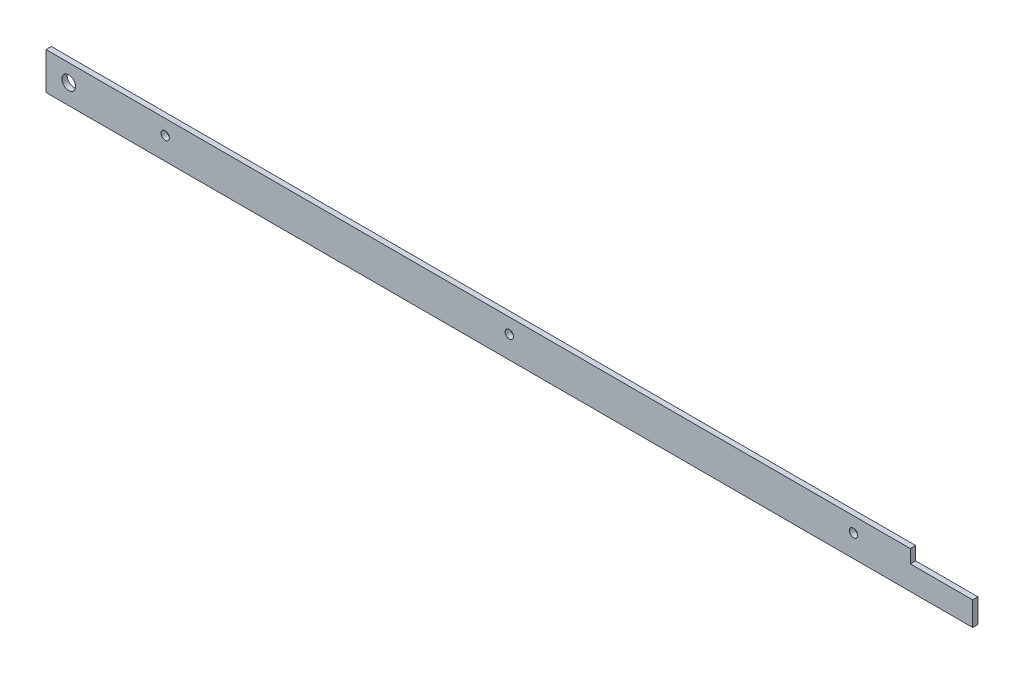
ISO-10303-21;
HEADER;
FILE_DESCRIPTION(('STEP AP214'),'2;1');
FILE_NAME('part.step','',(''),(''),'','','');
FILE_SCHEMA(('AUTOMOTIVE_DESIGN { 1 0 10303 214 1 1 1 1 }'));
ENDSEC;
DATA;
#1=APPLICATION_CONTEXT('core data for automotive mechanical design processes');
#2=APPLICATION_PROTOCOL_DEFINITION('international standard','automotive_design',2000,#1);
#3=PRODUCT_CONTEXT('',#1,'mechanical');
#4=PRODUCT('Part','Part','',(#3));
#5=PRODUCT_RELATED_PRODUCT_CATEGORY('part','',(#4));
#6=PRODUCT_DEFINITION_FORMATION('','',#4);
#7=PRODUCT_DEFINITION_CONTEXT('part definition',#1,'design');
#8=PRODUCT_DEFINITION('design','',#6,#7);
#9=PRODUCT_DEFINITION_SHAPE('','',#8);
#10=(LENGTH_UNIT() NAMED_UNIT(*) SI_UNIT(.MILLI.,.METRE.));
#11=(NAMED_UNIT(*) PLANE_ANGLE_UNIT() SI_UNIT($,.RADIAN.));
#12=(NAMED_UNIT(*) SI_UNIT($,.STERADIAN.) SOLID_ANGLE_UNIT());
#13=UNCERTAINTY_MEASURE_WITH_UNIT(LENGTH_MEASURE(1.E-05),#10,'distance_accuracy_value','');
#14=(GEOMETRIC_REPRESENTATION_CONTEXT(3) GLOBAL_UNCERTAINTY_ASSIGNED_CONTEXT((#13)) GLOBAL_UNIT_ASSIGNED_CONTEXT((#10,
#11,#12)) REPRESENTATION_CONTEXT('',''));
#15=CARTESIAN_POINT('',(0.,0.,0.));
#16=DIRECTION('',(0.,0.,1.));
#17=DIRECTION('',(1.,0.,0.));
#18=AXIS2_PLACEMENT_3D('',#15,#16,#17);
#19=CARTESIAN_POINT('',(0.,9.44698802890072,3.175));
#20=DIRECTION('',(0.,1.,0.));
#21=DIRECTION('',(0.,0.,1.));
#22=AXIS2_PLACEMENT_3D('',#19,#20,#21);
#23=PLANE('',#22);
#24=DIRECTION('',(1.,0.,0.));
#25=VECTOR('',#24,1.);
#26=CARTESIAN_POINT('',(0.,9.44698802890072,0.));
#27=LINE('',#26,#25);
#28=CARTESIAN_POINT('',(515.860000058,9.44698802890072,0.));
#29=VERTEX_POINT('',#28);
#30=CARTESIAN_POINT('',(553.1,9.44698802890072,0.));
#31=VERTEX_POINT('',#30);
#32=EDGE_CURVE('E137',#29,#31,#27,.T.);
#33=ORIENTED_EDGE('',*,*,#32,.F.);
#34=DIRECTION('',(0.,0.,-1.));
#35=VECTOR('',#34,1.);
#36=CARTESIAN_POINT('',(515.860000058,9.44698802890072,3.175));
#37=LINE('',#36,#35);
#38=CARTESIAN_POINT('',(515.860000058,9.44698802890072,3.175));
#39=VERTEX_POINT('',#38);
#40=EDGE_CURVE('E11',#39,#29,#37,.T.);
#41=ORIENTED_EDGE('',*,*,#40,.F.);
#42=DIRECTION('',(1.,0.,0.));
#43=VECTOR('',#42,1.);
#44=CARTESIAN_POINT('',(0.,9.44698802890072,3.175));
#45=LINE('',#44,#43);
#46=CARTESIAN_POINT('',(553.1,9.44698802890072,3.175));
#47=VERTEX_POINT('',#46);
#48=EDGE_CURVE('E162',#39,#47,#45,.T.);
#49=ORIENTED_EDGE('',*,*,#48,.T.);
#50=DIRECTION('',(0.,0.,-1.));
#51=VECTOR('',#50,1.);
#52=CARTESIAN_POINT('',(553.1,9.44698802890072,3.175));
#53=LINE('',#52,#51);
#54=EDGE_CURVE('E57',#47,#31,#53,.T.);
#55=ORIENTED_EDGE('',*,*,#54,.T.);
#56=EDGE_LOOP('',(#33,#41,#49,#55));
#57=FACE_BOUND('',#56,.T.);
#58=ADVANCED_FACE('F41',(#57),#23,.T.);
#59=CARTESIAN_POINT('',(515.860000058,0.,3.175));
#60=DIRECTION('',(-1.,0.,0.));
#61=DIRECTION('',(0.,0.,1.));
#62=AXIS2_PLACEMENT_3D('',#59,#60,#61);
#63=PLANE('',#62);
#64=DIRECTION('',(0.,1.,0.));
#65=VECTOR('',#64,1.);
#66=CARTESIAN_POINT('',(515.860000058,0.,0.));
#67=LINE('',#66,#65);
#68=CARTESIAN_POINT('',(515.860000058,17.3919880289007,0.));
#69=VERTEX_POINT('',#68);
#70=EDGE_CURVE('E139',#29,#69,#67,.T.);
#71=ORIENTED_EDGE('',*,*,#70,.T.);
#72=DIRECTION('',(0.,0.,-1.));
#73=VECTOR('',#72,1.);
#74=CARTESIAN_POINT('',(515.860000058,17.3919880289007,3.175));
#75=LINE('',#74,#73);
#76=CARTESIAN_POINT('',(515.860000058,17.3919880289007,3.175));
#77=VERTEX_POINT('',#76);
#78=EDGE_CURVE('E49',#77,#69,#75,.T.);
#79=ORIENTED_EDGE('',*,*,#78,.F.);
#80=DIRECTION('',(0.,1.,0.));
#81=VECTOR('',#80,1.);
#82=CARTESIAN_POINT('',(515.860000058,0.,3.175));
#83=LINE('',#82,#81);
#84=EDGE_CURVE('E120',#39,#77,#83,.T.);
#85=ORIENTED_EDGE('',*,*,#84,.F.);
#86=ORIENTED_EDGE('',*,*,#40,.T.);
#87=EDGE_LOOP('',(#71,#79,#85,#86));
#88=FACE_BOUND('',#87,.T.);
#89=ADVANCED_FACE('F191',(#88),#63,.F.);
#90=CARTESIAN_POINT('',(0.,17.3919880289006,3.175));
#91=DIRECTION('',(0.,-1.,0.));
#92=DIRECTION('',(1.,0.,0.));
#93=AXIS2_PLACEMENT_3D('',#90,#91,#92);
#94=PLANE('',#93);
#95=DIRECTION('',(-1.,0.,0.));
#96=VECTOR('',#95,1.);
#97=CARTESIAN_POINT('',(0.,17.3919880289006,0.));
#98=LINE('',#97,#96);
#99=CARTESIAN_POINT('',(0.,17.3919880289006,0.));
#100=VERTEX_POINT('',#99);
#101=EDGE_CURVE('E141',#69,#100,#98,.T.);
#102=ORIENTED_EDGE('',*,*,#101,.T.);
#103=DIRECTION('',(0.,0.,-1.));
#104=VECTOR('',#103,1.);
#105=CARTESIAN_POINT('',(0.,17.3919880289006,3.175));
#106=LINE('',#105,#104);
#107=CARTESIAN_POINT('',(0.,17.3919880289006,3.175));
#108=VERTEX_POINT('',#107);
#109=EDGE_CURVE('E105',#108,#100,#106,.T.);
#110=ORIENTED_EDGE('',*,*,#109,.F.);
#111=DIRECTION('',(-1.,0.,0.));
#112=VECTOR('',#111,1.);
#113=CARTESIAN_POINT('',(0.,17.3919880289006,3.175));
#114=LINE('',#113,#112);
#115=EDGE_CURVE('E117',#77,#108,#114,.T.);
#116=ORIENTED_EDGE('',*,*,#115,.F.);
#117=ORIENTED_EDGE('',*,*,#78,.T.);
#118=EDGE_LOOP('',(#102,#110,#116,#117));
#119=FACE_BOUND('',#118,.T.);
#120=ADVANCED_FACE('F169',(#119),#94,.F.);
#121=CARTESIAN_POINT('',(0.,0.,3.175));
#122=DIRECTION('',(-1.,0.,0.));
#123=DIRECTION('',(0.,0.,1.));
#124=AXIS2_PLACEMENT_3D('',#121,#122,#123);
#125=PLANE('',#124);
#126=DIRECTION('',(0.,1.,0.));
#127=VECTOR('',#126,1.);
#128=CARTESIAN_POINT('',(0.,0.,0.));
#129=LINE('',#128,#127);
#130=CARTESIAN_POINT('',(0.,-4.83301197109929,0.));
#131=VERTEX_POINT('',#130);
#132=EDGE_CURVE('E102',#131,#100,#129,.T.);
#133=ORIENTED_EDGE('',*,*,#132,.F.);
#134=DIRECTION('',(0.,0.,-1.));
#135=VECTOR('',#134,1.);
#136=CARTESIAN_POINT('',(0.,-4.83301197109929,3.175));
#137=LINE('',#136,#135);
#138=CARTESIAN_POINT('',(0.,-4.83301197109929,3.175));
#139=VERTEX_POINT('',#138);
#140=EDGE_CURVE('E96',#139,#131,#137,.T.);
#141=ORIENTED_EDGE('',*,*,#140,.F.);
#142=DIRECTION('',(0.,1.,0.));
#143=VECTOR('',#142,1.);
#144=CARTESIAN_POINT('',(0.,0.,3.175));
#145=LINE('',#144,#143);
#146=EDGE_CURVE('E100',#139,#108,#145,.T.);
#147=ORIENTED_EDGE('',*,*,#146,.T.);
#148=ORIENTED_EDGE('',*,*,#109,.T.);
#149=EDGE_LOOP('',(#133,#141,#147,#148));
#150=FACE_BOUND('',#149,.T.);
#151=ADVANCED_FACE('F98',(#150),#125,.T.);
#152=CARTESIAN_POINT('',(0.,-4.83301197109929,3.175));
#153=DIRECTION('',(0.,1.,0.));
#154=DIRECTION('',(0.,0.,1.));
#155=AXIS2_PLACEMENT_3D('',#152,#153,#154);
#156=PLANE('',#155);
#157=DIRECTION('',(1.,0.,0.));
#158=VECTOR('',#157,1.);
#159=CARTESIAN_POINT('',(0.,-4.83301197109929,0.));
#160=LINE('',#159,#158);
#161=CARTESIAN_POINT('',(553.1,-4.83301197109929,0.));
#162=VERTEX_POINT('',#161);
#163=EDGE_CURVE('E145',#131,#162,#160,.T.);
#164=ORIENTED_EDGE('',*,*,#163,.T.);
#165=DIRECTION('',(0.,0.,-1.));
#166=VECTOR('',#165,1.);
#167=CARTESIAN_POINT('',(553.1,-4.83301197109929,3.175));
#168=LINE('',#167,#166);
#169=CARTESIAN_POINT('',(553.1,-4.83301197109929,3.175));
#170=VERTEX_POINT('',#169);
#171=EDGE_CURVE('E77',#170,#162,#168,.T.);
#172=ORIENTED_EDGE('',*,*,#171,.F.);
#173=DIRECTION('',(1.,0.,0.));
#174=VECTOR('',#173,1.);
#175=CARTESIAN_POINT('',(0.,-4.83301197109929,3.175));
#176=LINE('',#175,#174);
#177=EDGE_CURVE('E107',#139,#170,#176,.T.);
#178=ORIENTED_EDGE('',*,*,#177,.F.);
#179=ORIENTED_EDGE('',*,*,#140,.T.);
#180=EDGE_LOOP('',(#164,#172,#178,#179));
#181=FACE_BOUND('',#180,.T.);
#182=ADVANCED_FACE('F108',(#181),#156,.F.);
#183=CARTESIAN_POINT('',(481.98,8.5094880289007,3.175));
#184=DIRECTION('',(0.,0.,-1.));
#185=DIRECTION('',(-1.,0.,0.));
#186=AXIS2_PLACEMENT_3D('',#183,#184,#185);
#187=CYLINDRICAL_SURFACE('',#186,2.48920000000001);
#188=CARTESIAN_POINT('',(481.98,8.5094880289007,3.175));
#189=DIRECTION('',(0.,0.,1.));
#190=DIRECTION('',(1.,0.,0.));
#191=AXIS2_PLACEMENT_3D('',#188,#189,#190);
#192=CIRCLE('',#191,2.48920000000001);
#193=CARTESIAN_POINT('',(484.4692,8.5094880289007,3.175));
#194=VERTEX_POINT('',#193);
#195=EDGE_CURVE('E131',#194,#194,#192,.T.);
#196=ORIENTED_EDGE('',*,*,#195,.T.);
#197=EDGE_LOOP('',(#196));
#198=FACE_BOUND('',#197,.T.);
#199=CARTESIAN_POINT('',(481.98,8.5094880289007,0.));
#200=DIRECTION('',(0.,0.,1.));
#201=DIRECTION('',(1.,0.,0.));
#202=AXIS2_PLACEMENT_3D('',#199,#200,#201);
#203=CIRCLE('',#202,2.48920000000001);
#204=CARTESIAN_POINT('',(484.4692,8.5094880289007,0.));
#205=VERTEX_POINT('',#204);
#206=EDGE_CURVE('E156',#205,#205,#203,.T.);
#207=ORIENTED_EDGE('',*,*,#206,.F.);
#208=EDGE_LOOP('',(#207));
#209=FACE_BOUND('',#208,.T.);
#210=ADVANCED_FACE('F202',(#198,#209),#187,.F.);
#211=CARTESIAN_POINT('',(276.55,8.5094880289007,3.175));
#212=DIRECTION('',(0.,0.,-1.));
#213=DIRECTION('',(-1.,0.,0.));
#214=AXIS2_PLACEMENT_3D('',#211,#212,#213);
#215=CYLINDRICAL_SURFACE('',#214,2.48920000000001);
#216=CARTESIAN_POINT('',(276.55,8.5094880289007,3.175));
#217=DIRECTION('',(0.,0.,1.));
#218=DIRECTION('',(1.,0.,0.));
#219=AXIS2_PLACEMENT_3D('',#216,#217,#218);
#220=CIRCLE('',#219,2.48920000000001);
#221=CARTESIAN_POINT('',(279.0392,8.5094880289007,3.175));
#222=VERTEX_POINT('',#221);
#223=EDGE_CURVE('E128',#222,#222,#220,.T.);
#224=ORIENTED_EDGE('',*,*,#223,.T.);
#225=EDGE_LOOP('',(#224));
#226=FACE_BOUND('',#225,.T.);
#227=CARTESIAN_POINT('',(276.55,8.5094880289007,0.));
#228=DIRECTION('',(0.,0.,1.));
#229=DIRECTION('',(1.,0.,0.));
#230=AXIS2_PLACEMENT_3D('',#227,#228,#229);
#231=CIRCLE('',#230,2.48920000000001);
#232=CARTESIAN_POINT('',(279.0392,8.5094880289007,0.));
#233=VERTEX_POINT('',#232);
#234=EDGE_CURVE('E153',#233,#233,#231,.T.);
#235=ORIENTED_EDGE('',*,*,#234,.F.);
#236=EDGE_LOOP('',(#235));
#237=FACE_BOUND('',#236,.T.);
#238=ADVANCED_FACE('F186',(#226,#237),#215,.F.);
#239=CARTESIAN_POINT('',(71.12,8.5094880289007,3.175));
#240=DIRECTION('',(0.,0.,-1.));
#241=DIRECTION('',(-1.,0.,0.));
#242=AXIS2_PLACEMENT_3D('',#239,#240,#241);
#243=CYLINDRICAL_SURFACE('',#242,2.4892);
#244=CARTESIAN_POINT('',(71.12,8.5094880289007,3.175));
#245=DIRECTION('',(0.,0.,1.));
#246=DIRECTION('',(1.,0.,0.));
#247=AXIS2_PLACEMENT_3D('',#244,#245,#246);
#248=CIRCLE('',#247,2.4892);
#249=CARTESIAN_POINT('',(73.6092,8.5094880289007,3.175));
#250=VERTEX_POINT('',#249);
#251=EDGE_CURVE('E125',#250,#250,#248,.T.);
#252=ORIENTED_EDGE('',*,*,#251,.T.);
#253=EDGE_LOOP('',(#252));
#254=FACE_BOUND('',#253,.T.);
#255=CARTESIAN_POINT('',(71.12,8.5094880289007,0.));
#256=DIRECTION('',(0.,0.,1.));
#257=DIRECTION('',(1.,0.,0.));
#258=AXIS2_PLACEMENT_3D('',#255,#256,#257);
#259=CIRCLE('',#258,2.4892);
#260=CARTESIAN_POINT('',(73.6092,8.5094880289007,0.));
#261=VERTEX_POINT('',#260);
#262=EDGE_CURVE('E150',#261,#261,#259,.T.);
#263=ORIENTED_EDGE('',*,*,#262,.F.);
#264=EDGE_LOOP('',(#263));
#265=FACE_BOUND('',#264,.T.);
#266=ADVANCED_FACE('F178',(#254,#265),#243,.F.);
#267=CARTESIAN_POINT('',(553.1,0.,3.175));
#268=DIRECTION('',(1.,0.,0.));
#269=DIRECTION('',(0.,0.,-1.));
#270=AXIS2_PLACEMENT_3D('',#267,#268,#269);
#271=PLANE('',#270);
#272=DIRECTION('',(0.,-1.,0.));
#273=VECTOR('',#272,1.);
#274=CARTESIAN_POINT('',(553.1,0.,0.));
#275=LINE('',#274,#273);
#276=EDGE_CURVE('E147',#31,#162,#275,.T.);
#277=ORIENTED_EDGE('',*,*,#276,.F.);
#278=ORIENTED_EDGE('',*,*,#54,.F.);
#279=DIRECTION('',(0.,-1.,0.));
#280=VECTOR('',#279,1.);
#281=CARTESIAN_POINT('',(553.1,0.,3.175));
#282=LINE('',#281,#280);
#283=EDGE_CURVE('E111',#47,#170,#282,.T.);
#284=ORIENTED_EDGE('',*,*,#283,.T.);
#285=ORIENTED_EDGE('',*,*,#171,.T.);
#286=EDGE_LOOP('',(#277,#278,#284,#285));
#287=FACE_BOUND('',#286,.T.);
#288=ADVANCED_FACE('F175',(#287),#271,.T.);
#289=CARTESIAN_POINT('',(13.54,7.02698802890071,3.175));
#290=DIRECTION('',(0.,0.,-1.));
#291=DIRECTION('',(-1.,0.,0.));
#292=AXIS2_PLACEMENT_3D('',#289,#290,#291);
#293=CYLINDRICAL_SURFACE('',#292,4.0635);
#294=CARTESIAN_POINT('',(13.54,7.02698802890071,3.175));
#295=DIRECTION('',(0.,0.,1.));
#296=DIRECTION('',(1.,0.,0.));
#297=AXIS2_PLACEMENT_3D('',#294,#295,#296);
#298=CIRCLE('',#297,4.0635);
#299=CARTESIAN_POINT('',(17.6035,7.02698802890071,3.175));
#300=VERTEX_POINT('',#299);
#301=EDGE_CURVE('E134',#300,#300,#298,.F.);
#302=ORIENTED_EDGE('',*,*,#301,.F.);
#303=EDGE_LOOP('',(#302));
#304=FACE_BOUND('',#303,.T.);
#305=CARTESIAN_POINT('',(13.54,7.02698802890071,0.));
#306=DIRECTION('',(0.,0.,1.));
#307=DIRECTION('',(1.,0.,0.));
#308=AXIS2_PLACEMENT_3D('',#305,#306,#307);
#309=CIRCLE('',#308,4.0635);
#310=CARTESIAN_POINT('',(17.6035,7.02698802890071,0.));
#311=VERTEX_POINT('',#310);
#312=EDGE_CURVE('E159',#311,#311,#309,.F.);
#313=ORIENTED_EDGE('',*,*,#312,.T.);
#314=EDGE_LOOP('',(#313));
#315=FACE_BOUND('',#314,.T.);
#316=ADVANCED_FACE('F177',(#304,#315),#293,.F.);
#317=CARTESIAN_POINT('',(0.,0.,3.175));
#318=DIRECTION('',(0.,0.,1.));
#319=DIRECTION('',(1.,0.,0.));
#320=AXIS2_PLACEMENT_3D('',#317,#318,#319);
#321=PLANE('',#320);
#322=ORIENTED_EDGE('',*,*,#48,.F.);
#323=ORIENTED_EDGE('',*,*,#84,.T.);
#324=ORIENTED_EDGE('',*,*,#115,.T.);
#325=ORIENTED_EDGE('',*,*,#146,.F.);
#326=ORIENTED_EDGE('',*,*,#177,.T.);
#327=ORIENTED_EDGE('',*,*,#283,.F.);
#328=EDGE_LOOP('',(#322,#323,#324,#325,#326,#327));
#329=FACE_BOUND('',#328,.T.);
#330=ORIENTED_EDGE('',*,*,#251,.F.);
#331=EDGE_LOOP('',(#330));
#332=FACE_BOUND('',#331,.T.);
#333=ORIENTED_EDGE('',*,*,#223,.F.);
#334=EDGE_LOOP('',(#333));
#335=FACE_BOUND('',#334,.T.);
#336=ORIENTED_EDGE('',*,*,#195,.F.);
#337=EDGE_LOOP('',(#336));
#338=FACE_BOUND('',#337,.T.);
#339=ORIENTED_EDGE('',*,*,#301,.T.);
#340=EDGE_LOOP('',(#339));
#341=FACE_BOUND('',#340,.T.);
#342=ADVANCED_FACE('F114',(#329,#332,#335,#338,#341),#321,.T.);
#343=CARTESIAN_POINT('',(0.,0.,0.));
#344=DIRECTION('',(0.,0.,1.));
#345=DIRECTION('',(1.,0.,0.));
#346=AXIS2_PLACEMENT_3D('',#343,#344,#345);
#347=PLANE('',#346);
#348=ORIENTED_EDGE('',*,*,#32,.T.);
#349=ORIENTED_EDGE('',*,*,#276,.T.);
#350=ORIENTED_EDGE('',*,*,#163,.F.);
#351=ORIENTED_EDGE('',*,*,#132,.T.);
#352=ORIENTED_EDGE('',*,*,#101,.F.);
#353=ORIENTED_EDGE('',*,*,#70,.F.);
#354=EDGE_LOOP('',(#348,#349,#350,#351,#352,#353));
#355=FACE_BOUND('',#354,.T.);
#356=ORIENTED_EDGE('',*,*,#262,.T.);
#357=EDGE_LOOP('',(#356));
#358=FACE_BOUND('',#357,.T.);
#359=ORIENTED_EDGE('',*,*,#234,.T.);
#360=EDGE_LOOP('',(#359));
#361=FACE_BOUND('',#360,.T.);
#362=ORIENTED_EDGE('',*,*,#206,.T.);
#363=EDGE_LOOP('',(#362));
#364=FACE_BOUND('',#363,.T.);
#365=ORIENTED_EDGE('',*,*,#312,.F.);
#366=EDGE_LOOP('',(#365));
#367=FACE_BOUND('',#366,.T.);
#368=ADVANCED_FACE('F173',(#355,#358,#361,#364,#367),#347,.F.);
#369=CLOSED_SHELL('',(#58,#89,#120,#151,#182,#210,#238,#266,#288,#316,#342,#368));
#370=MANIFOLD_SOLID_BREP('B2',#369);
#371=ADVANCED_BREP_SHAPE_REPRESENTATION('',(#18,#370),#14);
#372=SHAPE_DEFINITION_REPRESENTATION(#9,#371);
ENDSEC;
END-ISO-10303-21;
